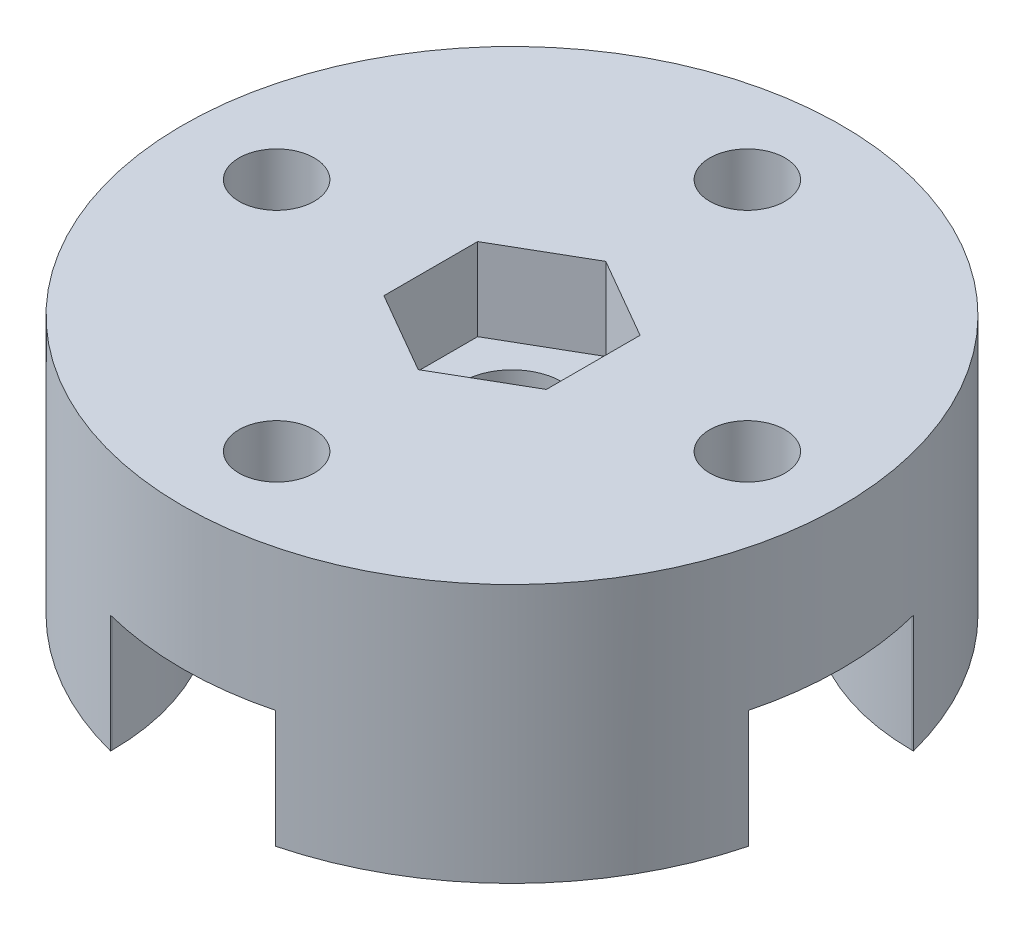
ISO-10303-21;
HEADER;
FILE_DESCRIPTION(('STEP AP214'),'2;1');
FILE_NAME('part.step','',(''),(''),'','','');
FILE_SCHEMA(('AUTOMOTIVE_DESIGN { 1 0 10303 214 1 1 1 1 }'));
ENDSEC;
DATA;
#1=APPLICATION_CONTEXT('core data for automotive mechanical design processes');
#2=APPLICATION_PROTOCOL_DEFINITION('international standard','automotive_design',2000,#1);
#3=PRODUCT_CONTEXT('',#1,'mechanical');
#4=PRODUCT('Part','Part','',(#3));
#5=PRODUCT_RELATED_PRODUCT_CATEGORY('part','',(#4));
#6=PRODUCT_DEFINITION_FORMATION('','',#4);
#7=PRODUCT_DEFINITION_CONTEXT('part definition',#1,'design');
#8=PRODUCT_DEFINITION('design','',#6,#7);
#9=PRODUCT_DEFINITION_SHAPE('','',#8);
#10=(LENGTH_UNIT() NAMED_UNIT(*) SI_UNIT(.MILLI.,.METRE.));
#11=(NAMED_UNIT(*) PLANE_ANGLE_UNIT() SI_UNIT($,.RADIAN.));
#12=(NAMED_UNIT(*) SI_UNIT($,.STERADIAN.) SOLID_ANGLE_UNIT());
#13=UNCERTAINTY_MEASURE_WITH_UNIT(LENGTH_MEASURE(1.E-05),#10,'distance_accuracy_value','');
#14=(GEOMETRIC_REPRESENTATION_CONTEXT(3) GLOBAL_UNCERTAINTY_ASSIGNED_CONTEXT((#13)) GLOBAL_UNIT_ASSIGNED_CONTEXT((#10,
#11,#12)) REPRESENTATION_CONTEXT('',''));
#15=CARTESIAN_POINT('',(0.,0.,0.));
#16=DIRECTION('',(0.,0.,1.));
#17=DIRECTION('',(1.,0.,0.));
#18=AXIS2_PLACEMENT_3D('',#15,#16,#17);
#19=CARTESIAN_POINT('',(0.,-2.5,0.));
#20=DIRECTION('',(0.,-1.,0.));
#21=DIRECTION('',(0.,0.,-1.));
#22=AXIS2_PLACEMENT_3D('',#19,#20,#21);
#23=PLANE('',#22);
#24=CARTESIAN_POINT('',(0.,-2.5,0.));
#25=DIRECTION('',(0.,-1.,0.));
#26=DIRECTION('',(0.,0.,-1.));
#27=AXIS2_PLACEMENT_3D('',#24,#25,#26);
#28=CIRCLE('',#27,3.625);
#29=CARTESIAN_POINT('',(0.,-2.5,-3.625));
#30=VERTEX_POINT('',#29);
#31=EDGE_CURVE('E424',#30,#30,#28,.F.);
#32=ORIENTED_EDGE('',*,*,#31,.T.);
#33=EDGE_LOOP('',(#32));
#34=FACE_BOUND('',#33,.T.);
#35=CARTESIAN_POINT('',(0.,-2.5,-10.));
#36=DIRECTION('',(0.,-1.,0.));
#37=DIRECTION('',(0.,0.,-1.));
#38=AXIS2_PLACEMENT_3D('',#35,#36,#37);
#39=CIRCLE('',#38,3.10000000000001);
#40=CARTESIAN_POINT('',(0.,-2.5,-13.1));
#41=VERTEX_POINT('',#40);
#42=EDGE_CURVE('E420',#41,#41,#39,.F.);
#43=ORIENTED_EDGE('',*,*,#42,.T.);
#44=EDGE_LOOP('',(#43));
#45=FACE_BOUND('',#44,.T.);
#46=CARTESIAN_POINT('',(10.,-2.5,0.));
#47=DIRECTION('',(0.,-1.,0.));
#48=DIRECTION('',(0.,0.,-1.));
#49=AXIS2_PLACEMENT_3D('',#46,#47,#48);
#50=CIRCLE('',#49,3.10000000000001);
#51=CARTESIAN_POINT('',(10.,-2.5,-3.09999999999997));
#52=VERTEX_POINT('',#51);
#53=EDGE_CURVE('E416',#52,#52,#50,.F.);
#54=ORIENTED_EDGE('',*,*,#53,.T.);
#55=EDGE_LOOP('',(#54));
#56=FACE_BOUND('',#55,.T.);
#57=CARTESIAN_POINT('',(-10.,-2.5,-1.04744440165294E-13));
#58=DIRECTION('',(0.,-1.,0.));
#59=DIRECTION('',(0.,0.,-1.));
#60=AXIS2_PLACEMENT_3D('',#57,#58,#59);
#61=CIRCLE('',#60,3.10000000000001);
#62=CARTESIAN_POINT('',(-10.,-2.5,-3.10000000000011));
#63=VERTEX_POINT('',#62);
#64=EDGE_CURVE('E412',#63,#63,#61,.F.);
#65=ORIENTED_EDGE('',*,*,#64,.T.);
#66=EDGE_LOOP('',(#65));
#67=FACE_BOUND('',#66,.T.);
#68=CARTESIAN_POINT('',(0.,-2.5,10.));
#69=DIRECTION('',(0.,-1.,0.));
#70=DIRECTION('',(0.,0.,-1.));
#71=AXIS2_PLACEMENT_3D('',#68,#69,#70);
#72=CIRCLE('',#71,3.1);
#73=CARTESIAN_POINT('',(0.,-2.5,6.9));
#74=VERTEX_POINT('',#73);
#75=EDGE_CURVE('E408',#74,#74,#72,.F.);
#76=ORIENTED_EDGE('',*,*,#75,.T.);
#77=EDGE_LOOP('',(#76));
#78=FACE_BOUND('',#77,.T.);
#79=CARTESIAN_POINT('',(0.,-2.5,0.));
#80=DIRECTION('',(0.,-1.,0.));
#81=DIRECTION('',(0.,0.,-1.));
#82=AXIS2_PLACEMENT_3D('',#79,#80,#81);
#83=CIRCLE('',#82,14.);
#84=CARTESIAN_POINT('',(-13.555441711726,-2.5,3.5));
#85=VERTEX_POINT('',#84);
#86=CARTESIAN_POINT('',(-13.555441711726,-2.5,-3.5));
#87=VERTEX_POINT('',#86);
#88=EDGE_CURVE('E320',#85,#87,#83,.T.);
#89=ORIENTED_EDGE('',*,*,#88,.T.);
#90=DIRECTION('',(1.,0.,0.));
#91=VECTOR('',#90,1.);
#92=CARTESIAN_POINT('',(0.,-2.5,-3.50000000000004));
#93=LINE('',#92,#91);
#94=CARTESIAN_POINT('',(-13.5000000000001,-2.5,-3.50000000000003));
#95=VERTEX_POINT('',#94);
#96=EDGE_CURVE('E278',#87,#95,#93,.T.);
#97=ORIENTED_EDGE('',*,*,#96,.T.);
#98=CARTESIAN_POINT('',(-13.5000000000001,-2.5,-13.5));
#99=DIRECTION('',(0.,-1.,0.));
#100=DIRECTION('',(0.,0.,-1.));
#101=AXIS2_PLACEMENT_3D('',#98,#99,#100);
#102=CIRCLE('',#101,10.);
#103=CARTESIAN_POINT('',(-3.50000000000014,-2.5,-13.5000000000001));
#104=VERTEX_POINT('',#103);
#105=EDGE_CURVE('E481',#95,#104,#102,.F.);
#106=ORIENTED_EDGE('',*,*,#105,.T.);
#107=DIRECTION('',(0.,0.,-1.));
#108=VECTOR('',#107,1.);
#109=CARTESIAN_POINT('',(-3.50000000000005,-2.5,0.));
#110=LINE('',#109,#108);
#111=CARTESIAN_POINT('',(-3.50000000000014,-2.5,-13.5554417117259));
#112=VERTEX_POINT('',#111);
#113=EDGE_CURVE('E270',#104,#112,#110,.T.);
#114=ORIENTED_EDGE('',*,*,#113,.T.);
#115=CARTESIAN_POINT('',(3.49999999999986,-2.5,-13.555441711726));
#116=VERTEX_POINT('',#115);
#117=EDGE_CURVE('E316',#112,#116,#83,.T.);
#118=ORIENTED_EDGE('',*,*,#117,.T.);
#119=DIRECTION('',(0.,0.,1.));
#120=VECTOR('',#119,1.);
#121=CARTESIAN_POINT('',(3.49999999999995,-2.5,0.));
#122=LINE('',#121,#120);
#123=CARTESIAN_POINT('',(3.49999999999986,-2.5,-13.5));
#124=VERTEX_POINT('',#123);
#125=EDGE_CURVE('E244',#116,#124,#122,.T.);
#126=ORIENTED_EDGE('',*,*,#125,.T.);
#127=CARTESIAN_POINT('',(13.4999999999999,-2.5,-13.5000000000001));
#128=DIRECTION('',(0.,-1.,0.));
#129=DIRECTION('',(0.,0.,-1.));
#130=AXIS2_PLACEMENT_3D('',#127,#128,#129);
#131=CIRCLE('',#130,10.);
#132=CARTESIAN_POINT('',(13.4999999999999,-2.5,-3.50000000000009));
#133=VERTEX_POINT('',#132);
#134=EDGE_CURVE('E484',#124,#133,#131,.F.);
#135=ORIENTED_EDGE('',*,*,#134,.T.);
#136=DIRECTION('',(1.,0.,0.));
#137=VECTOR('',#136,1.);
#138=CARTESIAN_POINT('',(0.,-2.5,-3.50000000000005));
#139=LINE('',#138,#137);
#140=CARTESIAN_POINT('',(13.5554417117259,-2.5,-3.50000000000009));
#141=VERTEX_POINT('',#140);
#142=EDGE_CURVE('E253',#133,#141,#139,.T.);
#143=ORIENTED_EDGE('',*,*,#142,.T.);
#144=CARTESIAN_POINT('',(13.555441711726,-2.5,3.4999999999999));
#145=VERTEX_POINT('',#144);
#146=EDGE_CURVE('E321',#141,#145,#83,.T.);
#147=ORIENTED_EDGE('',*,*,#146,.T.);
#148=DIRECTION('',(-1.,0.,0.));
#149=VECTOR('',#148,1.);
#150=CARTESIAN_POINT('',(0.,-2.5,3.49999999999995));
#151=LINE('',#150,#149);
#152=CARTESIAN_POINT('',(13.5,-2.5,3.49999999999991));
#153=VERTEX_POINT('',#152);
#154=EDGE_CURVE('E205',#145,#153,#151,.T.);
#155=ORIENTED_EDGE('',*,*,#154,.T.);
#156=CARTESIAN_POINT('',(13.5,-2.5,13.4999999999999));
#157=DIRECTION('',(0.,-1.,0.));
#158=DIRECTION('',(0.,0.,-1.));
#159=AXIS2_PLACEMENT_3D('',#156,#157,#158);
#160=CIRCLE('',#159,10.);
#161=CARTESIAN_POINT('',(3.50000000000005,-2.5,13.5));
#162=VERTEX_POINT('',#161);
#163=EDGE_CURVE('E58',#153,#162,#160,.F.);
#164=ORIENTED_EDGE('',*,*,#163,.T.);
#165=DIRECTION('',(0.,0.,1.));
#166=VECTOR('',#165,1.);
#167=CARTESIAN_POINT('',(3.49999999999995,-2.5,0.));
#168=LINE('',#167,#166);
#169=CARTESIAN_POINT('',(3.50000000000005,-2.5,13.5554417117259));
#170=VERTEX_POINT('',#169);
#171=EDGE_CURVE('E232',#162,#170,#168,.T.);
#172=ORIENTED_EDGE('',*,*,#171,.T.);
#173=CARTESIAN_POINT('',(-3.49999999999996,-2.5,13.555441711726));
#174=VERTEX_POINT('',#173);
#175=EDGE_CURVE('E628',#170,#174,#83,.T.);
#176=ORIENTED_EDGE('',*,*,#175,.T.);
#177=DIRECTION('',(0.,0.,-1.));
#178=VECTOR('',#177,1.);
#179=CARTESIAN_POINT('',(-3.50000000000005,-2.5,0.));
#180=LINE('',#179,#178);
#181=CARTESIAN_POINT('',(-3.49999999999996,-2.5,13.4999999999999));
#182=VERTEX_POINT('',#181);
#183=EDGE_CURVE('E210',#174,#182,#180,.T.);
#184=ORIENTED_EDGE('',*,*,#183,.T.);
#185=CARTESIAN_POINT('',(-13.5,-2.5,13.5));
#186=DIRECTION('',(0.,-1.,0.));
#187=DIRECTION('',(0.,0.,-1.));
#188=AXIS2_PLACEMENT_3D('',#185,#186,#187);
#189=CIRCLE('',#188,10.);
#190=CARTESIAN_POINT('',(-13.5,-2.5,3.5));
#191=VERTEX_POINT('',#190);
#192=EDGE_CURVE('E11',#182,#191,#189,.F.);
#193=ORIENTED_EDGE('',*,*,#192,.T.);
#194=DIRECTION('',(-1.,0.,0.));
#195=VECTOR('',#194,1.);
#196=CARTESIAN_POINT('',(0.,-2.5,3.49999999999995));
#197=LINE('',#196,#195);
#198=EDGE_CURVE('E294',#191,#85,#197,.T.);
#199=ORIENTED_EDGE('',*,*,#198,.T.);
#200=EDGE_LOOP('',(#89,#97,#106,#114,#118,#126,#135,#143,#147,#155,#164,#172,#176,#184,#193,#199));
#201=FACE_BOUND('',#200,.T.);
#202=ADVANCED_FACE('F49',(#34,#45,#56,#67,#78,#201),#23,.T.);
#203=CARTESIAN_POINT('',(0.,3.5,0.));
#204=DIRECTION('',(0.,1.,0.));
#205=DIRECTION('',(0.,0.,1.));
#206=AXIS2_PLACEMENT_3D('',#203,#204,#205);
#207=PLANE('',#206);
#208=CARTESIAN_POINT('',(0.,3.5,10.));
#209=DIRECTION('',(0.,1.,0.));
#210=DIRECTION('',(0.,0.,1.));
#211=AXIS2_PLACEMENT_3D('',#208,#209,#210);
#212=CIRCLE('',#211,1.6);
#213=CARTESIAN_POINT('',(0.,3.5,11.6));
#214=VERTEX_POINT('',#213);
#215=EDGE_CURVE('E326',#214,#214,#212,.T.);
#216=ORIENTED_EDGE('',*,*,#215,.F.);
#217=EDGE_LOOP('',(#216));
#218=FACE_BOUND('',#217,.T.);
#219=DIRECTION('',(-0.866025403784439,0.,0.5));
#220=VECTOR('',#219,1.);
#221=CARTESIAN_POINT('',(0.,3.5,-3.98371685740842));
#222=LINE('',#221,#220);
#223=CARTESIAN_POINT('',(0.,3.5,-3.98371685740842));
#224=VERTEX_POINT('',#223);
#225=CARTESIAN_POINT('',(-3.45,3.5,-1.99185842870421));
#226=VERTEX_POINT('',#225);
#227=EDGE_CURVE('E338',#224,#226,#222,.T.);
#228=ORIENTED_EDGE('',*,*,#227,.F.);
#229=DIRECTION('',(-0.866025403784439,0.,-0.5));
#230=VECTOR('',#229,1.);
#231=CARTESIAN_POINT('',(3.45,3.5,-1.99185842870421));
#232=LINE('',#231,#230);
#233=CARTESIAN_POINT('',(3.45,3.5,-1.99185842870421));
#234=VERTEX_POINT('',#233);
#235=EDGE_CURVE('E335',#234,#224,#232,.T.);
#236=ORIENTED_EDGE('',*,*,#235,.F.);
#237=DIRECTION('',(0.,0.,-1.));
#238=VECTOR('',#237,1.);
#239=CARTESIAN_POINT('',(3.45,3.5,1.99185842870421));
#240=LINE('',#239,#238);
#241=CARTESIAN_POINT('',(3.45,3.5,1.99185842870421));
#242=VERTEX_POINT('',#241);
#243=EDGE_CURVE('E352',#242,#234,#240,.T.);
#244=ORIENTED_EDGE('',*,*,#243,.F.);
#245=DIRECTION('',(0.866025403784439,0.,-0.5));
#246=VECTOR('',#245,1.);
#247=CARTESIAN_POINT('',(0.,3.5,3.98371685740842));
#248=LINE('',#247,#246);
#249=CARTESIAN_POINT('',(0.,3.5,3.98371685740842));
#250=VERTEX_POINT('',#249);
#251=EDGE_CURVE('E348',#250,#242,#248,.T.);
#252=ORIENTED_EDGE('',*,*,#251,.F.);
#253=DIRECTION('',(0.866025403784439,0.,0.5));
#254=VECTOR('',#253,1.);
#255=CARTESIAN_POINT('',(-3.45,3.5,1.99185842870421));
#256=LINE('',#255,#254);
#257=CARTESIAN_POINT('',(-3.45,3.5,1.99185842870421));
#258=VERTEX_POINT('',#257);
#259=EDGE_CURVE('E345',#258,#250,#256,.T.);
#260=ORIENTED_EDGE('',*,*,#259,.F.);
#261=DIRECTION('',(0.,0.,1.));
#262=VECTOR('',#261,1.);
#263=CARTESIAN_POINT('',(-3.45,3.5,-1.99185842870421));
#264=LINE('',#263,#262);
#265=EDGE_CURVE('E342',#226,#258,#264,.T.);
#266=ORIENTED_EDGE('',*,*,#265,.F.);
#267=EDGE_LOOP('',(#228,#236,#244,#252,#260,#266));
#268=FACE_BOUND('',#267,.T.);
#269=CARTESIAN_POINT('',(0.,3.5,-10.));
#270=DIRECTION('',(0.,1.,0.));
#271=DIRECTION('',(0.,0.,1.));
#272=AXIS2_PLACEMENT_3D('',#269,#270,#271);
#273=CIRCLE('',#272,1.6);
#274=CARTESIAN_POINT('',(0.,3.5,-8.4));
#275=VERTEX_POINT('',#274);
#276=EDGE_CURVE('E396',#275,#275,#273,.T.);
#277=ORIENTED_EDGE('',*,*,#276,.F.);
#278=EDGE_LOOP('',(#277));
#279=FACE_BOUND('',#278,.T.);
#280=CARTESIAN_POINT('',(0.,3.5,0.));
#281=DIRECTION('',(0.,1.,0.));
#282=DIRECTION('',(0.,0.,1.));
#283=AXIS2_PLACEMENT_3D('',#280,#281,#282);
#284=CIRCLE('',#283,14.);
#285=CARTESIAN_POINT('',(0.,3.5,14.));
#286=VERTEX_POINT('',#285);
#287=EDGE_CURVE('E400',#286,#286,#284,.T.);
#288=ORIENTED_EDGE('',*,*,#287,.T.);
#289=EDGE_LOOP('',(#288));
#290=FACE_BOUND('',#289,.T.);
#291=CARTESIAN_POINT('',(10.,3.5,0.));
#292=DIRECTION('',(0.,1.,0.));
#293=DIRECTION('',(0.,0.,1.));
#294=AXIS2_PLACEMENT_3D('',#291,#292,#293);
#295=CIRCLE('',#294,1.6);
#296=CARTESIAN_POINT('',(10.,3.5,1.60000000000004));
#297=VERTEX_POINT('',#296);
#298=EDGE_CURVE('E330',#297,#297,#295,.T.);
#299=ORIENTED_EDGE('',*,*,#298,.F.);
#300=EDGE_LOOP('',(#299));
#301=FACE_BOUND('',#300,.T.);
#302=CARTESIAN_POINT('',(-10.,3.5,-1.04744440165294E-13));
#303=DIRECTION('',(0.,1.,0.));
#304=DIRECTION('',(0.,0.,1.));
#305=AXIS2_PLACEMENT_3D('',#302,#303,#304);
#306=CIRCLE('',#305,1.6);
#307=CARTESIAN_POINT('',(-10.,3.5,1.5999999999999));
#308=VERTEX_POINT('',#307);
#309=EDGE_CURVE('E322',#308,#308,#306,.T.);
#310=ORIENTED_EDGE('',*,*,#309,.F.);
#311=EDGE_LOOP('',(#310));
#312=FACE_BOUND('',#311,.T.);
#313=ADVANCED_FACE('F506',(#218,#268,#279,#290,#301,#312),#207,.T.);
#314=CARTESIAN_POINT('',(0.,3.5,0.));
#315=DIRECTION('',(0.,-1.,0.));
#316=DIRECTION('',(0.,0.,-1.));
#317=AXIS2_PLACEMENT_3D('',#314,#315,#316);
#318=CYLINDRICAL_SURFACE('',#317,14.);
#319=ORIENTED_EDGE('',*,*,#287,.F.);
#320=EDGE_LOOP('',(#319));
#321=FACE_BOUND('',#320,.T.);
#322=ORIENTED_EDGE('',*,*,#146,.F.);
#323=DIRECTION('',(0.,1.,0.));
#324=VECTOR('',#323,1.);
#325=CARTESIAN_POINT('',(13.5554417117259,-7.5,-3.50000000000009));
#326=LINE('',#325,#324);
#327=CARTESIAN_POINT('',(13.5554417117259,-7.5,-3.50000000000009));
#328=VERTEX_POINT('',#327);
#329=EDGE_CURVE('E252',#328,#141,#326,.T.);
#330=ORIENTED_EDGE('',*,*,#329,.F.);
#331=CARTESIAN_POINT('',(0.,-7.5,0.));
#332=DIRECTION('',(0.,-1.,0.));
#333=DIRECTION('',(0.,0.,-1.));
#334=AXIS2_PLACEMENT_3D('',#331,#332,#333);
#335=CIRCLE('',#334,14.);
#336=CARTESIAN_POINT('',(3.49999999999986,-7.5,-13.555441711726));
#337=VERTEX_POINT('',#336);
#338=EDGE_CURVE('E248',#337,#328,#335,.T.);
#339=ORIENTED_EDGE('',*,*,#338,.F.);
#340=DIRECTION('',(0.,1.,0.));
#341=VECTOR('',#340,1.);
#342=CARTESIAN_POINT('',(3.49999999999986,-7.5,-13.555441711726));
#343=LINE('',#342,#341);
#344=EDGE_CURVE('E235',#337,#116,#343,.T.);
#345=ORIENTED_EDGE('',*,*,#344,.T.);
#346=ORIENTED_EDGE('',*,*,#117,.F.);
#347=DIRECTION('',(0.,1.,0.));
#348=VECTOR('',#347,1.);
#349=CARTESIAN_POINT('',(-3.50000000000014,-7.5,-13.5554417117259));
#350=LINE('',#349,#348);
#351=CARTESIAN_POINT('',(-3.50000000000014,-7.5,-13.5554417117259));
#352=VERTEX_POINT('',#351);
#353=EDGE_CURVE('E277',#352,#112,#350,.T.);
#354=ORIENTED_EDGE('',*,*,#353,.F.);
#355=CARTESIAN_POINT('',(0.,-7.5,0.));
#356=DIRECTION('',(0.,-1.,0.));
#357=DIRECTION('',(0.,0.,-1.));
#358=AXIS2_PLACEMENT_3D('',#355,#356,#357);
#359=CIRCLE('',#358,14.);
#360=CARTESIAN_POINT('',(-13.555441711726,-7.5,-3.5));
#361=VERTEX_POINT('',#360);
#362=EDGE_CURVE('E269',#361,#352,#359,.T.);
#363=ORIENTED_EDGE('',*,*,#362,.F.);
#364=DIRECTION('',(0.,1.,0.));
#365=VECTOR('',#364,1.);
#366=CARTESIAN_POINT('',(-13.555441711726,-7.5,-3.5));
#367=LINE('',#366,#365);
#368=EDGE_CURVE('E256',#361,#87,#367,.T.);
#369=ORIENTED_EDGE('',*,*,#368,.T.);
#370=ORIENTED_EDGE('',*,*,#88,.F.);
#371=DIRECTION('',(0.,1.,0.));
#372=VECTOR('',#371,1.);
#373=CARTESIAN_POINT('',(-13.555441711726,-7.5,3.5));
#374=LINE('',#373,#372);
#375=CARTESIAN_POINT('',(-13.555441711726,-7.5,3.5));
#376=VERTEX_POINT('',#375);
#377=EDGE_CURVE('E301',#376,#85,#374,.T.);
#378=ORIENTED_EDGE('',*,*,#377,.F.);
#379=CARTESIAN_POINT('',(0.,-7.5,0.));
#380=DIRECTION('',(0.,-1.,0.));
#381=DIRECTION('',(0.,0.,-1.));
#382=AXIS2_PLACEMENT_3D('',#379,#380,#381);
#383=CIRCLE('',#382,14.);
#384=CARTESIAN_POINT('',(-3.49999999999996,-7.5,13.555441711726));
#385=VERTEX_POINT('',#384);
#386=EDGE_CURVE('E293',#385,#376,#383,.T.);
#387=ORIENTED_EDGE('',*,*,#386,.F.);
#388=DIRECTION('',(0.,1.,0.));
#389=VECTOR('',#388,1.);
#390=CARTESIAN_POINT('',(-3.49999999999996,-7.5,13.555441711726));
#391=LINE('',#390,#389);
#392=EDGE_CURVE('E309',#385,#174,#391,.T.);
#393=ORIENTED_EDGE('',*,*,#392,.T.);
#394=ORIENTED_EDGE('',*,*,#175,.F.);
#395=DIRECTION('',(0.,1.,0.));
#396=VECTOR('',#395,1.);
#397=CARTESIAN_POINT('',(3.50000000000005,-7.5,13.5554417117259));
#398=LINE('',#397,#396);
#399=CARTESIAN_POINT('',(3.50000000000005,-7.5,13.5554417117259));
#400=VERTEX_POINT('',#399);
#401=EDGE_CURVE('E211',#400,#170,#398,.T.);
#402=ORIENTED_EDGE('',*,*,#401,.F.);
#403=CARTESIAN_POINT('',(0.,-7.5,0.));
#404=DIRECTION('',(0.,-1.,0.));
#405=DIRECTION('',(0.,0.,-1.));
#406=AXIS2_PLACEMENT_3D('',#403,#404,#405);
#407=CIRCLE('',#406,14.);
#408=CARTESIAN_POINT('',(13.555441711726,-7.5,3.4999999999999));
#409=VERTEX_POINT('',#408);
#410=EDGE_CURVE('E215',#409,#400,#407,.T.);
#411=ORIENTED_EDGE('',*,*,#410,.F.);
#412=DIRECTION('',(0.,1.,0.));
#413=VECTOR('',#412,1.);
#414=CARTESIAN_POINT('',(13.555441711726,-7.5,3.4999999999999));
#415=LINE('',#414,#413);
#416=EDGE_CURVE('E197',#409,#145,#415,.T.);
#417=ORIENTED_EDGE('',*,*,#416,.T.);
#418=EDGE_LOOP('',(#322,#330,#339,#345,#346,#354,#363,#369,#370,#378,#387,#393,#394,#402,#411,#417));
#419=FACE_BOUND('',#418,.T.);
#420=ADVANCED_FACE('F216',(#321,#419),#318,.T.);
#421=CARTESIAN_POINT('',(0.,3.5,-10.));
#422=DIRECTION('',(0.,-1.,0.));
#423=DIRECTION('',(0.,0.,-1.));
#424=AXIS2_PLACEMENT_3D('',#421,#422,#423);
#425=CYLINDRICAL_SURFACE('',#424,1.6);
#426=CARTESIAN_POINT('',(0.,-1.,-10.));
#427=DIRECTION('',(0.,-1.,0.));
#428=DIRECTION('',(0.,0.,-1.));
#429=AXIS2_PLACEMENT_3D('',#426,#427,#428);
#430=CIRCLE('',#429,1.6);
#431=CARTESIAN_POINT('',(0.,-1.,-11.6));
#432=VERTEX_POINT('',#431);
#433=EDGE_CURVE('E428',#432,#432,#430,.T.);
#434=ORIENTED_EDGE('',*,*,#433,.T.);
#435=EDGE_LOOP('',(#434));
#436=FACE_BOUND('',#435,.T.);
#437=ORIENTED_EDGE('',*,*,#276,.T.);
#438=EDGE_LOOP('',(#437));
#439=FACE_BOUND('',#438,.T.);
#440=ADVANCED_FACE('F560',(#436,#439),#425,.F.);
#441=CARTESIAN_POINT('',(3.45,3.5,-1.99185842870421));
#442=DIRECTION('',(-0.5,0.,0.866025403784439));
#443=DIRECTION('',(0.866025403784439,0.,0.5));
#444=AXIS2_PLACEMENT_3D('',#441,#442,#443);
#445=PLANE('',#444);
#446=DIRECTION('',(-0.866025403784439,0.,-0.5));
#447=VECTOR('',#446,1.);
#448=CARTESIAN_POINT('',(3.45,0.,-1.99185842870421));
#449=LINE('',#448,#447);
#450=CARTESIAN_POINT('',(3.45,0.,-1.99185842870421));
#451=VERTEX_POINT('',#450);
#452=CARTESIAN_POINT('',(0.,0.,-3.98371685740842));
#453=VERTEX_POINT('',#452);
#454=EDGE_CURVE('E334',#451,#453,#449,.T.);
#455=ORIENTED_EDGE('',*,*,#454,.F.);
#456=DIRECTION('',(0.,-1.,0.));
#457=VECTOR('',#456,1.);
#458=CARTESIAN_POINT('',(3.45,3.5,-1.99185842870421));
#459=LINE('',#458,#457);
#460=EDGE_CURVE('E355',#234,#451,#459,.T.);
#461=ORIENTED_EDGE('',*,*,#460,.F.);
#462=ORIENTED_EDGE('',*,*,#235,.T.);
#463=DIRECTION('',(0.,-1.,0.));
#464=VECTOR('',#463,1.);
#465=CARTESIAN_POINT('',(0.,3.5,-3.98371685740842));
#466=LINE('',#465,#464);
#467=EDGE_CURVE('E392',#224,#453,#466,.T.);
#468=ORIENTED_EDGE('',*,*,#467,.T.);
#469=EDGE_LOOP('',(#455,#461,#462,#468));
#470=FACE_BOUND('',#469,.T.);
#471=ADVANCED_FACE('F556',(#470),#445,.T.);
#472=CARTESIAN_POINT('',(0.,3.5,-3.98371685740842));
#473=DIRECTION('',(0.5,0.,0.866025403784439));
#474=DIRECTION('',(0.866025403784439,0.,-0.5));
#475=AXIS2_PLACEMENT_3D('',#472,#473,#474);
#476=PLANE('',#475);
#477=DIRECTION('',(-0.866025403784439,0.,0.5));
#478=VECTOR('',#477,1.);
#479=CARTESIAN_POINT('',(0.,0.,-3.98371685740842));
#480=LINE('',#479,#478);
#481=CARTESIAN_POINT('',(-3.45,0.,-1.99185842870421));
#482=VERTEX_POINT('',#481);
#483=EDGE_CURVE('E359',#453,#482,#480,.T.);
#484=ORIENTED_EDGE('',*,*,#483,.F.);
#485=ORIENTED_EDGE('',*,*,#467,.F.);
#486=ORIENTED_EDGE('',*,*,#227,.T.);
#487=DIRECTION('',(0.,-1.,0.));
#488=VECTOR('',#487,1.);
#489=CARTESIAN_POINT('',(-3.45,3.5,-1.99185842870421));
#490=LINE('',#489,#488);
#491=EDGE_CURVE('E389',#226,#482,#490,.T.);
#492=ORIENTED_EDGE('',*,*,#491,.T.);
#493=EDGE_LOOP('',(#484,#485,#486,#492));
#494=FACE_BOUND('',#493,.T.);
#495=ADVANCED_FACE('F552',(#494),#476,.T.);
#496=CARTESIAN_POINT('',(-3.45,3.5,-1.99185842870421));
#497=DIRECTION('',(1.,0.,0.));
#498=DIRECTION('',(0.,0.,-1.));
#499=AXIS2_PLACEMENT_3D('',#496,#497,#498);
#500=PLANE('',#499);
#501=DIRECTION('',(0.,0.,1.));
#502=VECTOR('',#501,1.);
#503=CARTESIAN_POINT('',(-3.45,0.,-1.99185842870421));
#504=LINE('',#503,#502);
#505=CARTESIAN_POINT('',(-3.45,0.,1.99185842870421));
#506=VERTEX_POINT('',#505);
#507=EDGE_CURVE('E363',#482,#506,#504,.T.);
#508=ORIENTED_EDGE('',*,*,#507,.F.);
#509=ORIENTED_EDGE('',*,*,#491,.F.);
#510=ORIENTED_EDGE('',*,*,#265,.T.);
#511=DIRECTION('',(0.,-1.,0.));
#512=VECTOR('',#511,1.);
#513=CARTESIAN_POINT('',(-3.45,3.5,1.99185842870421));
#514=LINE('',#513,#512);
#515=EDGE_CURVE('E386',#258,#506,#514,.T.);
#516=ORIENTED_EDGE('',*,*,#515,.T.);
#517=EDGE_LOOP('',(#508,#509,#510,#516));
#518=FACE_BOUND('',#517,.T.);
#519=ADVANCED_FACE('F548',(#518),#500,.T.);
#520=CARTESIAN_POINT('',(-3.45,3.5,1.99185842870421));
#521=DIRECTION('',(0.5,0.,-0.866025403784439));
#522=DIRECTION('',(-0.866025403784439,0.,-0.5));
#523=AXIS2_PLACEMENT_3D('',#520,#521,#522);
#524=PLANE('',#523);
#525=DIRECTION('',(0.866025403784439,0.,0.5));
#526=VECTOR('',#525,1.);
#527=CARTESIAN_POINT('',(-3.45,0.,1.99185842870421));
#528=LINE('',#527,#526);
#529=CARTESIAN_POINT('',(0.,0.,3.98371685740842));
#530=VERTEX_POINT('',#529);
#531=EDGE_CURVE('E367',#506,#530,#528,.T.);
#532=ORIENTED_EDGE('',*,*,#531,.F.);
#533=ORIENTED_EDGE('',*,*,#515,.F.);
#534=ORIENTED_EDGE('',*,*,#259,.T.);
#535=DIRECTION('',(0.,-1.,0.));
#536=VECTOR('',#535,1.);
#537=CARTESIAN_POINT('',(0.,3.5,3.98371685740842));
#538=LINE('',#537,#536);
#539=EDGE_CURVE('E383',#250,#530,#538,.T.);
#540=ORIENTED_EDGE('',*,*,#539,.T.);
#541=EDGE_LOOP('',(#532,#533,#534,#540));
#542=FACE_BOUND('',#541,.T.);
#543=ADVANCED_FACE('F544',(#542),#524,.T.);
#544=CARTESIAN_POINT('',(0.,3.5,3.98371685740842));
#545=DIRECTION('',(-0.5,0.,-0.866025403784439));
#546=DIRECTION('',(-0.866025403784439,0.,0.5));
#547=AXIS2_PLACEMENT_3D('',#544,#545,#546);
#548=PLANE('',#547);
#549=DIRECTION('',(0.866025403784439,0.,-0.5));
#550=VECTOR('',#549,1.);
#551=CARTESIAN_POINT('',(0.,0.,3.98371685740842));
#552=LINE('',#551,#550);
#553=CARTESIAN_POINT('',(3.45,0.,1.99185842870421));
#554=VERTEX_POINT('',#553);
#555=EDGE_CURVE('E371',#530,#554,#552,.T.);
#556=ORIENTED_EDGE('',*,*,#555,.F.);
#557=ORIENTED_EDGE('',*,*,#539,.F.);
#558=ORIENTED_EDGE('',*,*,#251,.T.);
#559=DIRECTION('',(0.,-1.,0.));
#560=VECTOR('',#559,1.);
#561=CARTESIAN_POINT('',(3.45,3.5,1.99185842870421));
#562=LINE('',#561,#560);
#563=EDGE_CURVE('E380',#242,#554,#562,.T.);
#564=ORIENTED_EDGE('',*,*,#563,.T.);
#565=EDGE_LOOP('',(#556,#557,#558,#564));
#566=FACE_BOUND('',#565,.T.);
#567=ADVANCED_FACE('F540',(#566),#548,.T.);
#568=CARTESIAN_POINT('',(3.45,3.5,1.99185842870421));
#569=DIRECTION('',(-1.,0.,0.));
#570=DIRECTION('',(0.,0.,1.));
#571=AXIS2_PLACEMENT_3D('',#568,#569,#570);
#572=PLANE('',#571);
#573=DIRECTION('',(0.,0.,-1.));
#574=VECTOR('',#573,1.);
#575=CARTESIAN_POINT('',(3.45,0.,1.99185842870421));
#576=LINE('',#575,#574);
#577=EDGE_CURVE('E339',#554,#451,#576,.T.);
#578=ORIENTED_EDGE('',*,*,#577,.F.);
#579=ORIENTED_EDGE('',*,*,#563,.F.);
#580=ORIENTED_EDGE('',*,*,#243,.T.);
#581=ORIENTED_EDGE('',*,*,#460,.T.);
#582=EDGE_LOOP('',(#578,#579,#580,#581));
#583=FACE_BOUND('',#582,.T.);
#584=ADVANCED_FACE('F536',(#583),#572,.T.);
#585=CARTESIAN_POINT('',(10.,3.5,0.));
#586=DIRECTION('',(0.,-1.,0.));
#587=DIRECTION('',(0.,0.,-1.));
#588=AXIS2_PLACEMENT_3D('',#585,#586,#587);
#589=CYLINDRICAL_SURFACE('',#588,1.6);
#590=CARTESIAN_POINT('',(10.,-1.,0.));
#591=DIRECTION('',(0.,-1.,0.));
#592=DIRECTION('',(0.,0.,-1.));
#593=AXIS2_PLACEMENT_3D('',#590,#591,#592);
#594=CIRCLE('',#593,1.6);
#595=CARTESIAN_POINT('',(10.,-1.,-1.59999999999997));
#596=VERTEX_POINT('',#595);
#597=EDGE_CURVE('E432',#596,#596,#594,.T.);
#598=ORIENTED_EDGE('',*,*,#597,.T.);
#599=EDGE_LOOP('',(#598));
#600=FACE_BOUND('',#599,.T.);
#601=ORIENTED_EDGE('',*,*,#298,.T.);
#602=EDGE_LOOP('',(#601));
#603=FACE_BOUND('',#602,.T.);
#604=ADVANCED_FACE('F532',(#600,#603),#589,.F.);
#605=CARTESIAN_POINT('',(0.,3.5,10.));
#606=DIRECTION('',(0.,-1.,0.));
#607=DIRECTION('',(0.,0.,-1.));
#608=AXIS2_PLACEMENT_3D('',#605,#606,#607);
#609=CYLINDRICAL_SURFACE('',#608,1.6);
#610=CARTESIAN_POINT('',(0.,-1.00000000000001,10.));
#611=DIRECTION('',(0.,-1.,0.));
#612=DIRECTION('',(0.,0.,-1.));
#613=AXIS2_PLACEMENT_3D('',#610,#611,#612);
#614=CIRCLE('',#613,1.6);
#615=CARTESIAN_POINT('',(0.,-1.00000000000001,8.4));
#616=VERTEX_POINT('',#615);
#617=EDGE_CURVE('E440',#616,#616,#614,.T.);
#618=ORIENTED_EDGE('',*,*,#617,.T.);
#619=EDGE_LOOP('',(#618));
#620=FACE_BOUND('',#619,.T.);
#621=ORIENTED_EDGE('',*,*,#215,.T.);
#622=EDGE_LOOP('',(#621));
#623=FACE_BOUND('',#622,.T.);
#624=ADVANCED_FACE('F528',(#620,#623),#609,.F.);
#625=CARTESIAN_POINT('',(-10.,3.5,-1.04744440165294E-13));
#626=DIRECTION('',(0.,-1.,0.));
#627=DIRECTION('',(0.,0.,-1.));
#628=AXIS2_PLACEMENT_3D('',#625,#626,#627);
#629=CYLINDRICAL_SURFACE('',#628,1.6);
#630=CARTESIAN_POINT('',(-10.,-1.,-1.04744440165294E-13));
#631=DIRECTION('',(0.,-1.,0.));
#632=DIRECTION('',(0.,0.,-1.));
#633=AXIS2_PLACEMENT_3D('',#630,#631,#632);
#634=CIRCLE('',#633,1.6);
#635=CARTESIAN_POINT('',(-10.,-1.,-1.60000000000011));
#636=VERTEX_POINT('',#635);
#637=EDGE_CURVE('E436',#636,#636,#634,.T.);
#638=ORIENTED_EDGE('',*,*,#637,.T.);
#639=EDGE_LOOP('',(#638));
#640=FACE_BOUND('',#639,.T.);
#641=ORIENTED_EDGE('',*,*,#309,.T.);
#642=EDGE_LOOP('',(#641));
#643=FACE_BOUND('',#642,.T.);
#644=ADVANCED_FACE('F524',(#640,#643),#629,.F.);
#645=CARTESIAN_POINT('',(0.,0.,0.));
#646=DIRECTION('',(0.,-1.,0.));
#647=DIRECTION('',(0.,0.,-1.));
#648=AXIS2_PLACEMENT_3D('',#645,#646,#647);
#649=PLANE('',#648);
#650=CARTESIAN_POINT('',(0.,0.,0.));
#651=DIRECTION('',(0.,-1.,0.));
#652=DIRECTION('',(0.,0.,-1.));
#653=AXIS2_PLACEMENT_3D('',#650,#651,#652);
#654=CIRCLE('',#653,2.125);
#655=CARTESIAN_POINT('',(0.,0.,-2.125));
#656=VERTEX_POINT('',#655);
#657=EDGE_CURVE('E312',#656,#656,#654,.T.);
#658=ORIENTED_EDGE('',*,*,#657,.T.);
#659=EDGE_LOOP('',(#658));
#660=FACE_BOUND('',#659,.T.);
#661=ORIENTED_EDGE('',*,*,#577,.T.);
#662=ORIENTED_EDGE('',*,*,#454,.T.);
#663=ORIENTED_EDGE('',*,*,#483,.T.);
#664=ORIENTED_EDGE('',*,*,#507,.T.);
#665=ORIENTED_EDGE('',*,*,#531,.T.);
#666=ORIENTED_EDGE('',*,*,#555,.T.);
#667=EDGE_LOOP('',(#661,#662,#663,#664,#665,#666));
#668=FACE_BOUND('',#667,.T.);
#669=ADVANCED_FACE('F521',(#660,#668),#649,.F.);
#670=CARTESIAN_POINT('',(0.,-2.5,0.));
#671=DIRECTION('',(0.,1.,0.));
#672=DIRECTION('',(0.,0.,1.));
#673=AXIS2_PLACEMENT_3D('',#670,#671,#672);
#674=CYLINDRICAL_SURFACE('',#673,2.125);
#675=CARTESIAN_POINT('',(0.,-1.,0.));
#676=DIRECTION('',(0.,-1.,0.));
#677=DIRECTION('',(0.,0.,-1.));
#678=AXIS2_PLACEMENT_3D('',#675,#676,#677);
#679=CIRCLE('',#678,2.125);
#680=CARTESIAN_POINT('',(0.,-1.,-2.125));
#681=VERTEX_POINT('',#680);
#682=EDGE_CURVE('E404',#681,#681,#679,.T.);
#683=ORIENTED_EDGE('',*,*,#682,.T.);
#684=EDGE_LOOP('',(#683));
#685=FACE_BOUND('',#684,.T.);
#686=ORIENTED_EDGE('',*,*,#657,.F.);
#687=EDGE_LOOP('',(#686));
#688=FACE_BOUND('',#687,.T.);
#689=ADVANCED_FACE('F519',(#685,#688),#674,.F.);
#690=CARTESIAN_POINT('',(0.,-1.,0.));
#691=DIRECTION('',(0.,-1.,0.));
#692=DIRECTION('',(0.,0.,-1.));
#693=AXIS2_PLACEMENT_3D('',#690,#691,#692);
#694=CONICAL_SURFACE('',#693,2.125,0.785398163397448);
#695=ORIENTED_EDGE('',*,*,#31,.F.);
#696=EDGE_LOOP('',(#695));
#697=FACE_BOUND('',#696,.T.);
#698=ORIENTED_EDGE('',*,*,#682,.F.);
#699=EDGE_LOOP('',(#698));
#700=FACE_BOUND('',#699,.T.);
#701=ADVANCED_FACE('F568',(#697,#700),#694,.F.);
#702=CARTESIAN_POINT('',(0.,-1.,-10.));
#703=DIRECTION('',(0.,-1.,0.));
#704=DIRECTION('',(0.,0.,-1.));
#705=AXIS2_PLACEMENT_3D('',#702,#703,#704);
#706=CONICAL_SURFACE('',#705,1.6,0.785398163397451);
#707=ORIENTED_EDGE('',*,*,#42,.F.);
#708=EDGE_LOOP('',(#707));
#709=FACE_BOUND('',#708,.T.);
#710=ORIENTED_EDGE('',*,*,#433,.F.);
#711=EDGE_LOOP('',(#710));
#712=FACE_BOUND('',#711,.T.);
#713=ADVANCED_FACE('F574',(#709,#712),#706,.F.);
#714=CARTESIAN_POINT('',(10.,-1.,0.));
#715=DIRECTION('',(0.,-1.,0.));
#716=DIRECTION('',(0.,0.,-1.));
#717=AXIS2_PLACEMENT_3D('',#714,#715,#716);
#718=CONICAL_SURFACE('',#717,1.6,0.785398163397451);
#719=ORIENTED_EDGE('',*,*,#53,.F.);
#720=EDGE_LOOP('',(#719));
#721=FACE_BOUND('',#720,.T.);
#722=ORIENTED_EDGE('',*,*,#597,.F.);
#723=EDGE_LOOP('',(#722));
#724=FACE_BOUND('',#723,.T.);
#725=ADVANCED_FACE('F581',(#721,#724),#718,.F.);
#726=CARTESIAN_POINT('',(-10.,-1.,-1.04744440165294E-13));
#727=DIRECTION('',(0.,-1.,0.));
#728=DIRECTION('',(0.,0.,-1.));
#729=AXIS2_PLACEMENT_3D('',#726,#727,#728);
#730=CONICAL_SURFACE('',#729,1.6,0.785398163397451);
#731=ORIENTED_EDGE('',*,*,#64,.F.);
#732=EDGE_LOOP('',(#731));
#733=FACE_BOUND('',#732,.T.);
#734=ORIENTED_EDGE('',*,*,#637,.F.);
#735=EDGE_LOOP('',(#734));
#736=FACE_BOUND('',#735,.T.);
#737=ADVANCED_FACE('F588',(#733,#736),#730,.F.);
#738=CARTESIAN_POINT('',(0.,-1.00000000000001,10.));
#739=DIRECTION('',(0.,-1.,0.));
#740=DIRECTION('',(0.,0.,-1.));
#741=AXIS2_PLACEMENT_3D('',#738,#739,#740);
#742=CONICAL_SURFACE('',#741,1.6,0.785398163397449);
#743=ORIENTED_EDGE('',*,*,#75,.F.);
#744=EDGE_LOOP('',(#743));
#745=FACE_BOUND('',#744,.T.);
#746=ORIENTED_EDGE('',*,*,#617,.F.);
#747=EDGE_LOOP('',(#746));
#748=FACE_BOUND('',#747,.T.);
#749=ADVANCED_FACE('F595',(#745,#748),#742,.F.);
#750=CARTESIAN_POINT('',(-3.50000000000005,-7.5,0.));
#751=DIRECTION('',(1.,0.,0.));
#752=DIRECTION('',(0.,0.,-1.));
#753=AXIS2_PLACEMENT_3D('',#750,#751,#752);
#754=PLANE('',#753);
#755=DIRECTION('',(0.,0.,-1.));
#756=VECTOR('',#755,1.);
#757=CARTESIAN_POINT('',(-3.50000000000005,-7.5,0.));
#758=LINE('',#757,#756);
#759=CARTESIAN_POINT('',(-3.49999999999996,-7.5,13.4999999999999));
#760=VERTEX_POINT('',#759);
#761=EDGE_CURVE('E289',#385,#760,#758,.T.);
#762=ORIENTED_EDGE('',*,*,#761,.T.);
#763=DIRECTION('',(0.,1.,0.));
#764=VECTOR('',#763,1.);
#765=CARTESIAN_POINT('',(-3.49999999999996,-7.5,13.4999999999999));
#766=LINE('',#765,#764);
#767=EDGE_CURVE('E472',#760,#182,#766,.T.);
#768=ORIENTED_EDGE('',*,*,#767,.T.);
#769=ORIENTED_EDGE('',*,*,#183,.F.);
#770=ORIENTED_EDGE('',*,*,#392,.F.);
#771=EDGE_LOOP('',(#762,#768,#769,#770));
#772=FACE_BOUND('',#771,.T.);
#773=ADVANCED_FACE('F601',(#772),#754,.T.);
#774=CARTESIAN_POINT('',(0.,-7.5,3.49999999999995));
#775=DIRECTION('',(0.,0.,-1.));
#776=DIRECTION('',(-1.,0.,0.));
#777=AXIS2_PLACEMENT_3D('',#774,#775,#776);
#778=PLANE('',#777);
#779=ORIENTED_EDGE('',*,*,#198,.F.);
#780=DIRECTION('',(0.,1.,0.));
#781=VECTOR('',#780,1.);
#782=CARTESIAN_POINT('',(-13.5,-7.5,3.5));
#783=LINE('',#782,#781);
#784=CARTESIAN_POINT('',(-13.5,-7.5,3.5));
#785=VERTEX_POINT('',#784);
#786=EDGE_CURVE('E65',#191,#785,#783,.F.);
#787=ORIENTED_EDGE('',*,*,#786,.T.);
#788=DIRECTION('',(-1.,0.,0.));
#789=VECTOR('',#788,1.);
#790=CARTESIAN_POINT('',(0.,-7.5,3.49999999999995));
#791=LINE('',#790,#789);
#792=EDGE_CURVE('E298',#785,#376,#791,.T.);
#793=ORIENTED_EDGE('',*,*,#792,.T.);
#794=ORIENTED_EDGE('',*,*,#377,.T.);
#795=EDGE_LOOP('',(#779,#787,#793,#794));
#796=FACE_BOUND('',#795,.T.);
#797=ADVANCED_FACE('F663',(#796),#778,.T.);
#798=CARTESIAN_POINT('',(0.,-7.5,0.));
#799=DIRECTION('',(0.,-1.,0.));
#800=DIRECTION('',(0.,0.,-1.));
#801=AXIS2_PLACEMENT_3D('',#798,#799,#800);
#802=PLANE('',#801);
#803=ORIENTED_EDGE('',*,*,#792,.F.);
#804=CARTESIAN_POINT('',(-13.5,-7.5,13.5));
#805=DIRECTION('',(0.,-1.,0.));
#806=DIRECTION('',(0.,0.,-1.));
#807=AXIS2_PLACEMENT_3D('',#804,#805,#806);
#808=CIRCLE('',#807,10.);
#809=EDGE_CURVE('E478',#785,#760,#808,.T.);
#810=ORIENTED_EDGE('',*,*,#809,.T.);
#811=ORIENTED_EDGE('',*,*,#761,.F.);
#812=ORIENTED_EDGE('',*,*,#386,.T.);
#813=EDGE_LOOP('',(#803,#810,#811,#812));
#814=FACE_BOUND('',#813,.T.);
#815=ADVANCED_FACE('F660',(#814),#802,.T.);
#816=CARTESIAN_POINT('',(3.49999999999995,-7.5,0.));
#817=DIRECTION('',(-1.,0.,0.));
#818=DIRECTION('',(0.,0.,1.));
#819=AXIS2_PLACEMENT_3D('',#816,#817,#818);
#820=PLANE('',#819);
#821=ORIENTED_EDGE('',*,*,#171,.F.);
#822=DIRECTION('',(0.,1.,0.));
#823=VECTOR('',#822,1.);
#824=CARTESIAN_POINT('',(3.50000000000005,-7.5,13.5));
#825=LINE('',#824,#823);
#826=CARTESIAN_POINT('',(3.50000000000005,-7.5,13.5));
#827=VERTEX_POINT('',#826);
#828=EDGE_CURVE('E467',#162,#827,#825,.F.);
#829=ORIENTED_EDGE('',*,*,#828,.T.);
#830=DIRECTION('',(0.,0.,1.));
#831=VECTOR('',#830,1.);
#832=CARTESIAN_POINT('',(3.49999999999995,-7.5,0.));
#833=LINE('',#832,#831);
#834=EDGE_CURVE('E227',#827,#400,#833,.T.);
#835=ORIENTED_EDGE('',*,*,#834,.T.);
#836=ORIENTED_EDGE('',*,*,#401,.T.);
#837=EDGE_LOOP('',(#821,#829,#835,#836));
#838=FACE_BOUND('',#837,.T.);
#839=ADVANCED_FACE('F493',(#838),#820,.T.);
#840=CARTESIAN_POINT('',(0.,-7.5,3.49999999999995));
#841=DIRECTION('',(0.,0.,-1.));
#842=DIRECTION('',(-1.,0.,0.));
#843=AXIS2_PLACEMENT_3D('',#840,#841,#842);
#844=PLANE('',#843);
#845=DIRECTION('',(-1.,0.,0.));
#846=VECTOR('',#845,1.);
#847=CARTESIAN_POINT('',(0.,-7.5,3.49999999999995));
#848=LINE('',#847,#846);
#849=CARTESIAN_POINT('',(13.5,-7.5,3.49999999999991));
#850=VERTEX_POINT('',#849);
#851=EDGE_CURVE('E202',#409,#850,#848,.T.);
#852=ORIENTED_EDGE('',*,*,#851,.T.);
#853=DIRECTION('',(0.,1.,0.));
#854=VECTOR('',#853,1.);
#855=CARTESIAN_POINT('',(13.5,-7.5,3.49999999999991));
#856=LINE('',#855,#854);
#857=EDGE_CURVE('E464',#850,#153,#856,.T.);
#858=ORIENTED_EDGE('',*,*,#857,.T.);
#859=ORIENTED_EDGE('',*,*,#154,.F.);
#860=ORIENTED_EDGE('',*,*,#416,.F.);
#861=EDGE_LOOP('',(#852,#858,#859,#860));
#862=FACE_BOUND('',#861,.T.);
#863=ADVANCED_FACE('F199',(#862),#844,.T.);
#864=CARTESIAN_POINT('',(0.,-7.5,0.));
#865=DIRECTION('',(0.,-1.,0.));
#866=DIRECTION('',(0.,0.,-1.));
#867=AXIS2_PLACEMENT_3D('',#864,#865,#866);
#868=PLANE('',#867);
#869=ORIENTED_EDGE('',*,*,#834,.F.);
#870=CARTESIAN_POINT('',(13.5,-7.5,13.4999999999999));
#871=DIRECTION('',(0.,-1.,0.));
#872=DIRECTION('',(0.,0.,-1.));
#873=AXIS2_PLACEMENT_3D('',#870,#871,#872);
#874=CIRCLE('',#873,10.);
#875=EDGE_CURVE('E225',#827,#850,#874,.T.);
#876=ORIENTED_EDGE('',*,*,#875,.T.);
#877=ORIENTED_EDGE('',*,*,#851,.F.);
#878=ORIENTED_EDGE('',*,*,#410,.T.);
#879=EDGE_LOOP('',(#869,#876,#877,#878));
#880=FACE_BOUND('',#879,.T.);
#881=ADVANCED_FACE('F223',(#880),#868,.T.);
#882=CARTESIAN_POINT('',(0.,-7.5,-3.50000000000005));
#883=DIRECTION('',(0.,0.,1.));
#884=DIRECTION('',(1.,0.,0.));
#885=AXIS2_PLACEMENT_3D('',#882,#883,#884);
#886=PLANE('',#885);
#887=ORIENTED_EDGE('',*,*,#142,.F.);
#888=DIRECTION('',(0.,1.,0.));
#889=VECTOR('',#888,1.);
#890=CARTESIAN_POINT('',(13.4999999999999,-7.5,-3.50000000000009));
#891=LINE('',#890,#889);
#892=CARTESIAN_POINT('',(13.4999999999999,-7.5,-3.50000000000009));
#893=VERTEX_POINT('',#892);
#894=EDGE_CURVE('E458',#133,#893,#891,.F.);
#895=ORIENTED_EDGE('',*,*,#894,.T.);
#896=DIRECTION('',(1.,0.,0.));
#897=VECTOR('',#896,1.);
#898=CARTESIAN_POINT('',(0.,-7.5,-3.50000000000005));
#899=LINE('',#898,#897);
#900=EDGE_CURVE('E240',#893,#328,#899,.T.);
#901=ORIENTED_EDGE('',*,*,#900,.T.);
#902=ORIENTED_EDGE('',*,*,#329,.T.);
#903=EDGE_LOOP('',(#887,#895,#901,#902));
#904=FACE_BOUND('',#903,.T.);
#905=ADVANCED_FACE('F636',(#904),#886,.T.);
#906=CARTESIAN_POINT('',(3.49999999999995,-7.5,0.));
#907=DIRECTION('',(-1.,0.,0.));
#908=DIRECTION('',(0.,0.,1.));
#909=AXIS2_PLACEMENT_3D('',#906,#907,#908);
#910=PLANE('',#909);
#911=DIRECTION('',(0.,0.,1.));
#912=VECTOR('',#911,1.);
#913=CARTESIAN_POINT('',(3.49999999999995,-7.5,0.));
#914=LINE('',#913,#912);
#915=CARTESIAN_POINT('',(3.49999999999986,-7.5,-13.5));
#916=VERTEX_POINT('',#915);
#917=EDGE_CURVE('E243',#337,#916,#914,.T.);
#918=ORIENTED_EDGE('',*,*,#917,.T.);
#919=DIRECTION('',(0.,1.,0.));
#920=VECTOR('',#919,1.);
#921=CARTESIAN_POINT('',(3.49999999999986,-7.5,-13.5));
#922=LINE('',#921,#920);
#923=EDGE_CURVE('E454',#916,#124,#922,.T.);
#924=ORIENTED_EDGE('',*,*,#923,.T.);
#925=ORIENTED_EDGE('',*,*,#125,.F.);
#926=ORIENTED_EDGE('',*,*,#344,.F.);
#927=EDGE_LOOP('',(#918,#924,#925,#926));
#928=FACE_BOUND('',#927,.T.);
#929=ADVANCED_FACE('F644',(#928),#910,.T.);
#930=CARTESIAN_POINT('',(0.,-7.5,0.));
#931=DIRECTION('',(0.,-1.,0.));
#932=DIRECTION('',(0.,0.,-1.));
#933=AXIS2_PLACEMENT_3D('',#930,#931,#932);
#934=PLANE('',#933);
#935=ORIENTED_EDGE('',*,*,#900,.F.);
#936=CARTESIAN_POINT('',(13.4999999999999,-7.5,-13.5000000000001));
#937=DIRECTION('',(0.,-1.,0.));
#938=DIRECTION('',(0.,0.,-1.));
#939=AXIS2_PLACEMENT_3D('',#936,#937,#938);
#940=CIRCLE('',#939,10.);
#941=EDGE_CURVE('E461',#893,#916,#940,.T.);
#942=ORIENTED_EDGE('',*,*,#941,.T.);
#943=ORIENTED_EDGE('',*,*,#917,.F.);
#944=ORIENTED_EDGE('',*,*,#338,.T.);
#945=EDGE_LOOP('',(#935,#942,#943,#944));
#946=FACE_BOUND('',#945,.T.);
#947=ADVANCED_FACE('F641',(#946),#934,.T.);
#948=CARTESIAN_POINT('',(0.,-7.5,-3.50000000000004));
#949=DIRECTION('',(0.,0.,1.));
#950=DIRECTION('',(1.,0.,0.));
#951=AXIS2_PLACEMENT_3D('',#948,#949,#950);
#952=PLANE('',#951);
#953=DIRECTION('',(1.,0.,0.));
#954=VECTOR('',#953,1.);
#955=CARTESIAN_POINT('',(0.,-7.5,-3.50000000000004));
#956=LINE('',#955,#954);
#957=CARTESIAN_POINT('',(-13.5000000000001,-7.5,-3.50000000000003));
#958=VERTEX_POINT('',#957);
#959=EDGE_CURVE('E265',#361,#958,#956,.T.);
#960=ORIENTED_EDGE('',*,*,#959,.T.);
#961=DIRECTION('',(0.,1.,0.));
#962=VECTOR('',#961,1.);
#963=CARTESIAN_POINT('',(-13.5000000000001,-7.5,-3.50000000000003));
#964=LINE('',#963,#962);
#965=EDGE_CURVE('E444',#958,#95,#964,.T.);
#966=ORIENTED_EDGE('',*,*,#965,.T.);
#967=ORIENTED_EDGE('',*,*,#96,.F.);
#968=ORIENTED_EDGE('',*,*,#368,.F.);
#969=EDGE_LOOP('',(#960,#966,#967,#968));
#970=FACE_BOUND('',#969,.T.);
#971=ADVANCED_FACE('F618',(#970),#952,.T.);
#972=CARTESIAN_POINT('',(-3.50000000000005,-7.5,0.));
#973=DIRECTION('',(1.,0.,0.));
#974=DIRECTION('',(0.,0.,-1.));
#975=AXIS2_PLACEMENT_3D('',#972,#973,#974);
#976=PLANE('',#975);
#977=ORIENTED_EDGE('',*,*,#113,.F.);
#978=DIRECTION('',(0.,1.,0.));
#979=VECTOR('',#978,1.);
#980=CARTESIAN_POINT('',(-3.50000000000014,-7.5,-13.5000000000001));
#981=LINE('',#980,#979);
#982=CARTESIAN_POINT('',(-3.50000000000014,-7.5,-13.5000000000001));
#983=VERTEX_POINT('',#982);
#984=EDGE_CURVE('E448',#104,#983,#981,.F.);
#985=ORIENTED_EDGE('',*,*,#984,.T.);
#986=DIRECTION('',(0.,0.,-1.));
#987=VECTOR('',#986,1.);
#988=CARTESIAN_POINT('',(-3.50000000000005,-7.5,0.));
#989=LINE('',#988,#987);
#990=EDGE_CURVE('E274',#983,#352,#989,.T.);
#991=ORIENTED_EDGE('',*,*,#990,.T.);
#992=ORIENTED_EDGE('',*,*,#353,.T.);
#993=EDGE_LOOP('',(#977,#985,#991,#992));
#994=FACE_BOUND('',#993,.T.);
#995=ADVANCED_FACE('F609',(#994),#976,.T.);
#996=CARTESIAN_POINT('',(0.,-7.5,0.));
#997=DIRECTION('',(0.,-1.,0.));
#998=DIRECTION('',(0.,0.,-1.));
#999=AXIS2_PLACEMENT_3D('',#996,#997,#998);
#1000=PLANE('',#999);
#1001=ORIENTED_EDGE('',*,*,#990,.F.);
#1002=CARTESIAN_POINT('',(-13.5000000000001,-7.5,-13.5));
#1003=DIRECTION('',(0.,-1.,0.));
#1004=DIRECTION('',(0.,0.,-1.));
#1005=AXIS2_PLACEMENT_3D('',#1002,#1003,#1004);
#1006=CIRCLE('',#1005,10.);
#1007=EDGE_CURVE('E451',#983,#958,#1006,.T.);
#1008=ORIENTED_EDGE('',*,*,#1007,.T.);
#1009=ORIENTED_EDGE('',*,*,#959,.F.);
#1010=ORIENTED_EDGE('',*,*,#362,.T.);
#1011=EDGE_LOOP('',(#1001,#1008,#1009,#1010));
#1012=FACE_BOUND('',#1011,.T.);
#1013=ADVANCED_FACE('F604',(#1012),#1000,.T.);
#1014=CARTESIAN_POINT('',(-13.5000000000001,-7.5,-13.5));
#1015=DIRECTION('',(0.,1.,0.));
#1016=DIRECTION('',(0.,0.,1.));
#1017=AXIS2_PLACEMENT_3D('',#1014,#1015,#1016);
#1018=CYLINDRICAL_SURFACE('',#1017,10.);
#1019=ORIENTED_EDGE('',*,*,#1007,.F.);
#1020=ORIENTED_EDGE('',*,*,#984,.F.);
#1021=ORIENTED_EDGE('',*,*,#105,.F.);
#1022=ORIENTED_EDGE('',*,*,#965,.F.);
#1023=EDGE_LOOP('',(#1019,#1020,#1021,#1022));
#1024=FACE_BOUND('',#1023,.T.);
#1025=ADVANCED_FACE('F502',(#1024),#1018,.T.);
#1026=CARTESIAN_POINT('',(13.4999999999999,-7.5,-13.5000000000001));
#1027=DIRECTION('',(0.,1.,0.));
#1028=DIRECTION('',(0.,0.,1.));
#1029=AXIS2_PLACEMENT_3D('',#1026,#1027,#1028);
#1030=CYLINDRICAL_SURFACE('',#1029,10.);
#1031=ORIENTED_EDGE('',*,*,#941,.F.);
#1032=ORIENTED_EDGE('',*,*,#894,.F.);
#1033=ORIENTED_EDGE('',*,*,#134,.F.);
#1034=ORIENTED_EDGE('',*,*,#923,.F.);
#1035=EDGE_LOOP('',(#1031,#1032,#1033,#1034));
#1036=FACE_BOUND('',#1035,.T.);
#1037=ADVANCED_FACE('F496',(#1036),#1030,.T.);
#1038=CARTESIAN_POINT('',(13.5,-7.5,13.4999999999999));
#1039=DIRECTION('',(0.,1.,0.));
#1040=DIRECTION('',(0.,0.,1.));
#1041=AXIS2_PLACEMENT_3D('',#1038,#1039,#1040);
#1042=CYLINDRICAL_SURFACE('',#1041,10.);
#1043=ORIENTED_EDGE('',*,*,#875,.F.);
#1044=ORIENTED_EDGE('',*,*,#828,.F.);
#1045=ORIENTED_EDGE('',*,*,#163,.F.);
#1046=ORIENTED_EDGE('',*,*,#857,.F.);
#1047=EDGE_LOOP('',(#1043,#1044,#1045,#1046));
#1048=FACE_BOUND('',#1047,.T.);
#1049=ADVANCED_FACE('F494',(#1048),#1042,.T.);
#1050=CARTESIAN_POINT('',(-13.5,-7.5,13.5));
#1051=DIRECTION('',(0.,1.,0.));
#1052=DIRECTION('',(0.,0.,1.));
#1053=AXIS2_PLACEMENT_3D('',#1050,#1051,#1052);
#1054=CYLINDRICAL_SURFACE('',#1053,10.);
#1055=ORIENTED_EDGE('',*,*,#809,.F.);
#1056=ORIENTED_EDGE('',*,*,#786,.F.);
#1057=ORIENTED_EDGE('',*,*,#192,.F.);
#1058=ORIENTED_EDGE('',*,*,#767,.F.);
#1059=EDGE_LOOP('',(#1055,#1056,#1057,#1058));
#1060=FACE_BOUND('',#1059,.T.);
#1061=ADVANCED_FACE('F51',(#1060),#1054,.T.);
#1062=CLOSED_SHELL('',(#202,#313,#420,#440,#471,#495,#519,#543,#567,#584,#604,#624,#644,#669,
#689,#701,#713,#725,#737,#749,#773,#797,#815,#839,#863,#881,#905,#929,#947,#971,#995,#1013,
#1025,#1037,#1049,#1061));
#1063=MANIFOLD_SOLID_BREP('B2',#1062);
#1064=ADVANCED_BREP_SHAPE_REPRESENTATION('',(#18,#1063),#14);
#1065=SHAPE_DEFINITION_REPRESENTATION(#9,#1064);
ENDSEC;
END-ISO-10303-21;
